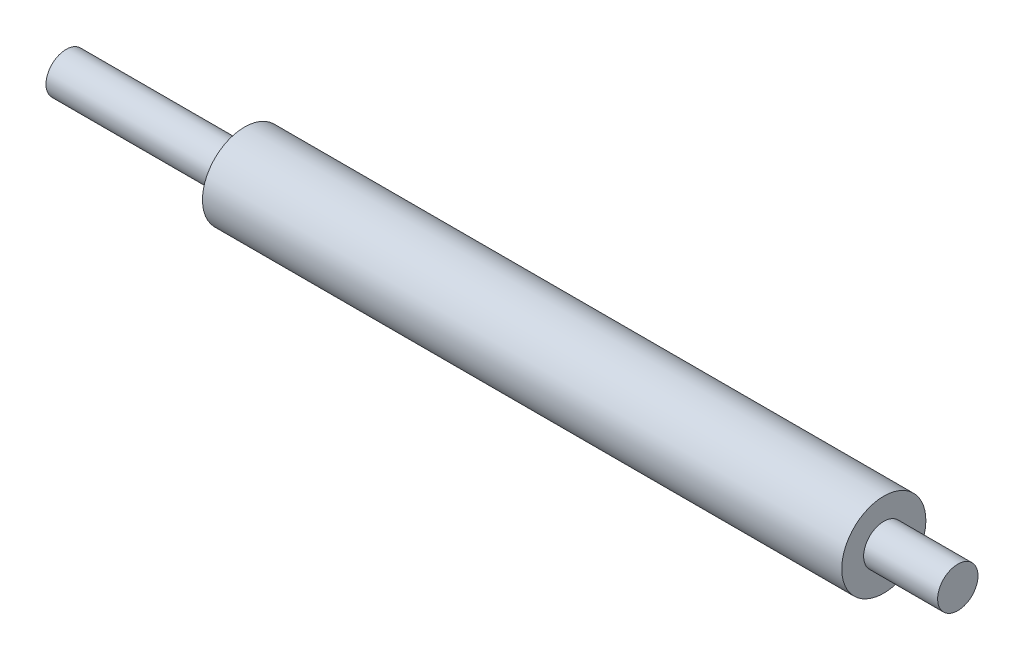
ISO-10303-21;
HEADER;
FILE_DESCRIPTION(('STEP AP214'),'2;1');
FILE_NAME('part.step','',(''),(''),'','','');
FILE_SCHEMA(('AUTOMOTIVE_DESIGN { 1 0 10303 214 1 1 1 1 }'));
ENDSEC;
DATA;
#1=APPLICATION_CONTEXT('core data for automotive mechanical design processes');
#2=APPLICATION_PROTOCOL_DEFINITION('international standard','automotive_design',2000,#1);
#3=PRODUCT_CONTEXT('',#1,'mechanical');
#4=PRODUCT('Part','Part','',(#3));
#5=PRODUCT_RELATED_PRODUCT_CATEGORY('part','',(#4));
#6=PRODUCT_DEFINITION_FORMATION('','',#4);
#7=PRODUCT_DEFINITION_CONTEXT('part definition',#1,'design');
#8=PRODUCT_DEFINITION('design','',#6,#7);
#9=PRODUCT_DEFINITION_SHAPE('','',#8);
#10=(LENGTH_UNIT() NAMED_UNIT(*) SI_UNIT(.MILLI.,.METRE.));
#11=(NAMED_UNIT(*) PLANE_ANGLE_UNIT() SI_UNIT($,.RADIAN.));
#12=(NAMED_UNIT(*) SI_UNIT($,.STERADIAN.) SOLID_ANGLE_UNIT());
#13=UNCERTAINTY_MEASURE_WITH_UNIT(LENGTH_MEASURE(1.E-05),#10,'distance_accuracy_value','');
#14=(GEOMETRIC_REPRESENTATION_CONTEXT(3) GLOBAL_UNCERTAINTY_ASSIGNED_CONTEXT((#13)) GLOBAL_UNIT_ASSIGNED_CONTEXT((#10,
#11,#12)) REPRESENTATION_CONTEXT('',''));
#15=CARTESIAN_POINT('',(0.,0.,0.));
#16=DIRECTION('',(0.,0.,1.));
#17=DIRECTION('',(1.,0.,0.));
#18=AXIS2_PLACEMENT_3D('',#15,#16,#17);
#19=CARTESIAN_POINT('',(0.,0.,0.));
#20=DIRECTION('',(-1.,0.,0.));
#21=DIRECTION('',(0.,-1.,0.));
#22=AXIS2_PLACEMENT_3D('',#19,#20,#21);
#23=PLANE('',#22);
#24=CARTESIAN_POINT('',(0.,0.,0.));
#25=DIRECTION('',(1.,0.,0.));
#26=DIRECTION('',(0.,1.,0.));
#27=AXIS2_PLACEMENT_3D('',#24,#25,#26);
#28=CIRCLE('',#27,6.);
#29=CARTESIAN_POINT('',(0.,6.,0.));
#30=VERTEX_POINT('',#29);
#31=EDGE_CURVE('E10',#30,#30,#28,.T.);
#32=ORIENTED_EDGE('',*,*,#31,.F.);
#33=EDGE_LOOP('',(#32));
#34=FACE_BOUND('',#33,.T.);
#35=ADVANCED_FACE('F43',(#34),#23,.T.);
#36=CARTESIAN_POINT('',(265.,0.,0.));
#37=DIRECTION('',(1.,0.,0.));
#38=DIRECTION('',(0.,1.,0.));
#39=AXIS2_PLACEMENT_3D('',#36,#37,#38);
#40=CYLINDRICAL_SURFACE('',#39,6.);
#41=ORIENTED_EDGE('',*,*,#31,.T.);
#42=EDGE_LOOP('',(#41));
#43=FACE_BOUND('',#42,.T.);
#44=CARTESIAN_POINT('',(53.,0.,0.));
#45=DIRECTION('',(1.,0.,0.));
#46=DIRECTION('',(0.,1.,0.));
#47=AXIS2_PLACEMENT_3D('',#44,#45,#46);
#48=CIRCLE('',#47,6.);
#49=CARTESIAN_POINT('',(53.,6.,0.));
#50=VERTEX_POINT('',#49);
#51=EDGE_CURVE('E50',#50,#50,#48,.T.);
#52=ORIENTED_EDGE('',*,*,#51,.F.);
#53=EDGE_LOOP('',(#52));
#54=FACE_BOUND('',#53,.T.);
#55=ADVANCED_FACE('F91',(#43,#54),#40,.T.);
#56=CARTESIAN_POINT('',(53.,6.,0.));
#57=DIRECTION('',(-1.,0.,0.));
#58=DIRECTION('',(0.,-1.,0.));
#59=AXIS2_PLACEMENT_3D('',#56,#57,#58);
#60=PLANE('',#59);
#61=ORIENTED_EDGE('',*,*,#51,.T.);
#62=EDGE_LOOP('',(#61));
#63=FACE_BOUND('',#62,.T.);
#64=CARTESIAN_POINT('',(53.,0.,0.));
#65=DIRECTION('',(1.,0.,0.));
#66=DIRECTION('',(0.,1.,0.));
#67=AXIS2_PLACEMENT_3D('',#64,#65,#66);
#68=CIRCLE('',#67,12.5);
#69=CARTESIAN_POINT('',(53.,12.5,0.));
#70=VERTEX_POINT('',#69);
#71=EDGE_CURVE('E55',#70,#70,#68,.T.);
#72=ORIENTED_EDGE('',*,*,#71,.F.);
#73=EDGE_LOOP('',(#72));
#74=FACE_BOUND('',#73,.T.);
#75=ADVANCED_FACE('F96',(#63,#74),#60,.T.);
#76=CARTESIAN_POINT('',(265.,0.,0.));
#77=DIRECTION('',(1.,0.,0.));
#78=DIRECTION('',(0.,1.,0.));
#79=AXIS2_PLACEMENT_3D('',#76,#77,#78);
#80=CYLINDRICAL_SURFACE('',#79,12.5);
#81=ORIENTED_EDGE('',*,*,#71,.T.);
#82=EDGE_LOOP('',(#81));
#83=FACE_BOUND('',#82,.T.);
#84=CARTESIAN_POINT('',(243.,0.,0.));
#85=DIRECTION('',(1.,0.,0.));
#86=DIRECTION('',(0.,1.,0.));
#87=AXIS2_PLACEMENT_3D('',#84,#85,#86);
#88=CIRCLE('',#87,12.5);
#89=CARTESIAN_POINT('',(243.,12.5,0.));
#90=VERTEX_POINT('',#89);
#91=EDGE_CURVE('E60',#90,#90,#88,.T.);
#92=ORIENTED_EDGE('',*,*,#91,.F.);
#93=EDGE_LOOP('',(#92));
#94=FACE_BOUND('',#93,.T.);
#95=ADVANCED_FACE('F87',(#83,#94),#80,.T.);
#96=CARTESIAN_POINT('',(243.,12.5,0.));
#97=DIRECTION('',(1.,0.,0.));
#98=DIRECTION('',(0.,1.,0.));
#99=AXIS2_PLACEMENT_3D('',#96,#97,#98);
#100=PLANE('',#99);
#101=ORIENTED_EDGE('',*,*,#91,.T.);
#102=EDGE_LOOP('',(#101));
#103=FACE_BOUND('',#102,.T.);
#104=CARTESIAN_POINT('',(243.,0.,0.));
#105=DIRECTION('',(1.,0.,0.));
#106=DIRECTION('',(0.,1.,0.));
#107=AXIS2_PLACEMENT_3D('',#104,#105,#106);
#108=CIRCLE('',#107,6.);
#109=CARTESIAN_POINT('',(243.,6.,0.));
#110=VERTEX_POINT('',#109);
#111=EDGE_CURVE('E66',#110,#110,#108,.T.);
#112=ORIENTED_EDGE('',*,*,#111,.F.);
#113=EDGE_LOOP('',(#112));
#114=FACE_BOUND('',#113,.T.);
#115=ADVANCED_FACE('F79',(#103,#114),#100,.T.);
#116=CARTESIAN_POINT('',(265.,0.,0.));
#117=DIRECTION('',(1.,0.,0.));
#118=DIRECTION('',(0.,1.,0.));
#119=AXIS2_PLACEMENT_3D('',#116,#117,#118);
#120=CYLINDRICAL_SURFACE('',#119,6.);
#121=ORIENTED_EDGE('',*,*,#111,.T.);
#122=EDGE_LOOP('',(#121));
#123=FACE_BOUND('',#122,.T.);
#124=CARTESIAN_POINT('',(265.,0.,0.));
#125=DIRECTION('',(1.,0.,0.));
#126=DIRECTION('',(0.,1.,0.));
#127=AXIS2_PLACEMENT_3D('',#124,#125,#126);
#128=CIRCLE('',#127,6.);
#129=CARTESIAN_POINT('',(265.,6.,0.));
#130=VERTEX_POINT('',#129);
#131=EDGE_CURVE('E70',#130,#130,#128,.T.);
#132=ORIENTED_EDGE('',*,*,#131,.F.);
#133=EDGE_LOOP('',(#132));
#134=FACE_BOUND('',#133,.T.);
#135=ADVANCED_FACE('F77',(#123,#134),#120,.T.);
#136=CARTESIAN_POINT('',(265.,6.,0.));
#137=DIRECTION('',(1.,0.,0.));
#138=DIRECTION('',(0.,1.,0.));
#139=AXIS2_PLACEMENT_3D('',#136,#137,#138);
#140=PLANE('',#139);
#141=ORIENTED_EDGE('',*,*,#131,.T.);
#142=EDGE_LOOP('',(#141));
#143=FACE_BOUND('',#142,.T.);
#144=ADVANCED_FACE('F75',(#143),#140,.T.);
#145=CLOSED_SHELL('',(#35,#55,#75,#95,#115,#135,#144));
#146=MANIFOLD_SOLID_BREP('B2',#145);
#147=ADVANCED_BREP_SHAPE_REPRESENTATION('',(#18,#146),#14);
#148=SHAPE_DEFINITION_REPRESENTATION(#9,#147);
ENDSEC;
END-ISO-10303-21;
